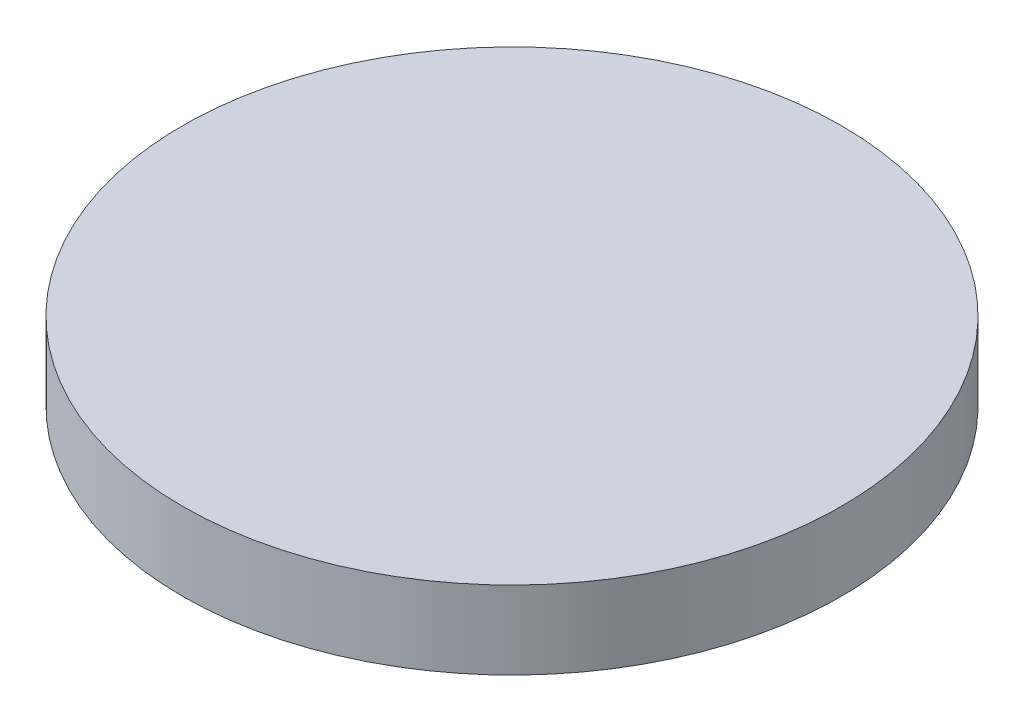
ISO-10303-21;
HEADER;
FILE_DESCRIPTION(('STEP AP214'),'2;1');
FILE_NAME('part.step','',(''),(''),'','','');
FILE_SCHEMA(('AUTOMOTIVE_DESIGN { 1 0 10303 214 1 1 1 1 }'));
ENDSEC;
DATA;
#1=APPLICATION_CONTEXT('core data for automotive mechanical design processes');
#2=APPLICATION_PROTOCOL_DEFINITION('international standard','automotive_design',2000,#1);
#3=PRODUCT_CONTEXT('',#1,'mechanical');
#4=PRODUCT('Part','Part','',(#3));
#5=PRODUCT_RELATED_PRODUCT_CATEGORY('part','',(#4));
#6=PRODUCT_DEFINITION_FORMATION('','',#4);
#7=PRODUCT_DEFINITION_CONTEXT('part definition',#1,'design');
#8=PRODUCT_DEFINITION('design','',#6,#7);
#9=PRODUCT_DEFINITION_SHAPE('','',#8);
#10=(LENGTH_UNIT() NAMED_UNIT(*) SI_UNIT(.MILLI.,.METRE.));
#11=(NAMED_UNIT(*) PLANE_ANGLE_UNIT() SI_UNIT($,.RADIAN.));
#12=(NAMED_UNIT(*) SI_UNIT($,.STERADIAN.) SOLID_ANGLE_UNIT());
#13=UNCERTAINTY_MEASURE_WITH_UNIT(LENGTH_MEASURE(1.E-05),#10,'distance_accuracy_value','');
#14=(GEOMETRIC_REPRESENTATION_CONTEXT(3) GLOBAL_UNCERTAINTY_ASSIGNED_CONTEXT((#13)) GLOBAL_UNIT_ASSIGNED_CONTEXT((#10,
#11,#12)) REPRESENTATION_CONTEXT('',''));
#15=CARTESIAN_POINT('',(0.,0.,0.));
#16=DIRECTION('',(0.,0.,1.));
#17=DIRECTION('',(1.,0.,0.));
#18=AXIS2_PLACEMENT_3D('',#15,#16,#17);
#19=CARTESIAN_POINT('',(0.,6.,0.));
#20=DIRECTION('',(0.,-1.,0.));
#21=DIRECTION('',(0.,0.,-1.));
#22=AXIS2_PLACEMENT_3D('',#19,#20,#21);
#23=CYLINDRICAL_SURFACE('',#22,46.5);
#24=CARTESIAN_POINT('',(0.,6.,0.));
#25=DIRECTION('',(0.,1.,0.));
#26=DIRECTION('',(0.,0.,1.));
#27=AXIS2_PLACEMENT_3D('',#24,#25,#26);
#28=CIRCLE('',#27,46.5);
#29=CARTESIAN_POINT('',(0.,6.,46.5));
#30=VERTEX_POINT('',#29);
#31=EDGE_CURVE('E10',#30,#30,#28,.T.);
#32=ORIENTED_EDGE('',*,*,#31,.F.);
#33=EDGE_LOOP('',(#32));
#34=FACE_BOUND('',#33,.T.);
#35=CARTESIAN_POINT('',(0.,-5.,0.));
#36=DIRECTION('',(0.,-1.,0.));
#37=DIRECTION('',(0.,0.,-1.));
#38=AXIS2_PLACEMENT_3D('',#35,#36,#37);
#39=CIRCLE('',#38,46.5);
#40=CARTESIAN_POINT('',(0.,-5.,-46.5));
#41=VERTEX_POINT('',#40);
#42=EDGE_CURVE('E39',#41,#41,#39,.T.);
#43=ORIENTED_EDGE('',*,*,#42,.F.);
#44=EDGE_LOOP('',(#43));
#45=FACE_BOUND('',#44,.T.);
#46=ADVANCED_FACE('F33',(#34,#45),#23,.T.);
#47=CARTESIAN_POINT('',(0.,6.,0.));
#48=DIRECTION('',(0.,1.,0.));
#49=DIRECTION('',(0.,0.,1.));
#50=AXIS2_PLACEMENT_3D('',#47,#48,#49);
#51=PLANE('',#50);
#52=ORIENTED_EDGE('',*,*,#31,.T.);
#53=EDGE_LOOP('',(#52));
#54=FACE_BOUND('',#53,.T.);
#55=ADVANCED_FACE('F64',(#54),#51,.T.);
#56=CARTESIAN_POINT('',(0.,-5.,0.));
#57=DIRECTION('',(0.,-1.,0.));
#58=DIRECTION('',(0.,0.,-1.));
#59=AXIS2_PLACEMENT_3D('',#56,#57,#58);
#60=PLANE('',#59);
#61=ORIENTED_EDGE('',*,*,#42,.T.);
#62=EDGE_LOOP('',(#61));
#63=FACE_BOUND('',#62,.T.);
#64=CARTESIAN_POINT('',(0.,-5.,0.));
#65=DIRECTION('',(0.,-1.,0.));
#66=DIRECTION('',(0.,0.,-1.));
#67=AXIS2_PLACEMENT_3D('',#64,#65,#66);
#68=CIRCLE('',#67,41.5);
#69=CARTESIAN_POINT('',(0.,-5.,-41.5));
#70=VERTEX_POINT('',#69);
#71=EDGE_CURVE('E43',#70,#70,#68,.T.);
#72=ORIENTED_EDGE('',*,*,#71,.F.);
#73=EDGE_LOOP('',(#72));
#74=FACE_BOUND('',#73,.T.);
#75=ADVANCED_FACE('F57',(#63,#74),#60,.T.);
#76=CARTESIAN_POINT('',(0.,-5.,0.));
#77=DIRECTION('',(0.,1.,0.));
#78=DIRECTION('',(0.,0.,1.));
#79=AXIS2_PLACEMENT_3D('',#76,#77,#78);
#80=CYLINDRICAL_SURFACE('',#79,41.5);
#81=ORIENTED_EDGE('',*,*,#71,.T.);
#82=EDGE_LOOP('',(#81));
#83=FACE_BOUND('',#82,.T.);
#84=CARTESIAN_POINT('',(0.,0.,0.));
#85=DIRECTION('',(0.,-1.,0.));
#86=DIRECTION('',(0.,0.,-1.));
#87=AXIS2_PLACEMENT_3D('',#84,#85,#86);
#88=CIRCLE('',#87,41.5);
#89=CARTESIAN_POINT('',(0.,0.,-41.5));
#90=VERTEX_POINT('',#89);
#91=EDGE_CURVE('E47',#90,#90,#88,.T.);
#92=ORIENTED_EDGE('',*,*,#91,.F.);
#93=EDGE_LOOP('',(#92));
#94=FACE_BOUND('',#93,.T.);
#95=ADVANCED_FACE('F55',(#83,#94),#80,.F.);
#96=CARTESIAN_POINT('',(0.,0.,0.));
#97=DIRECTION('',(0.,1.,0.));
#98=DIRECTION('',(0.,0.,1.));
#99=AXIS2_PLACEMENT_3D('',#96,#97,#98);
#100=PLANE('',#99);
#101=ORIENTED_EDGE('',*,*,#91,.T.);
#102=EDGE_LOOP('',(#101));
#103=FACE_BOUND('',#102,.T.);
#104=ADVANCED_FACE('F53',(#103),#100,.F.);
#105=CLOSED_SHELL('',(#46,#55,#75,#95,#104));
#106=MANIFOLD_SOLID_BREP('B2',#105);
#107=ADVANCED_BREP_SHAPE_REPRESENTATION('',(#18,#106),#14);
#108=SHAPE_DEFINITION_REPRESENTATION(#9,#107);
ENDSEC;
END-ISO-10303-21;
